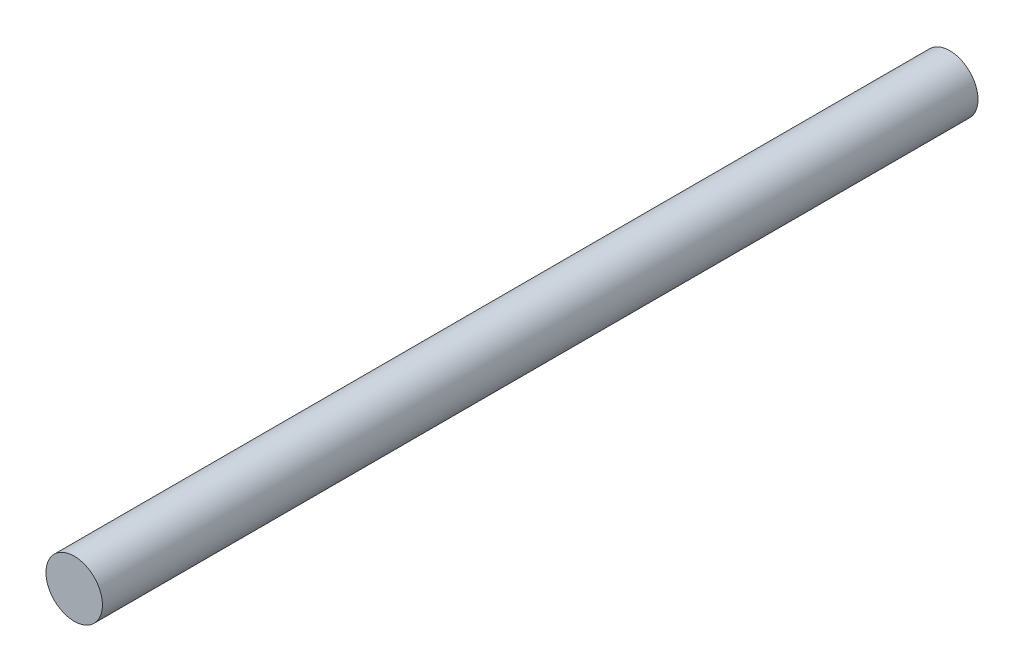
ISO-10303-21;
HEADER;
FILE_DESCRIPTION(('STEP AP214'),'2;1');
FILE_NAME('part.step','',(''),(''),'','','');
FILE_SCHEMA(('AUTOMOTIVE_DESIGN { 1 0 10303 214 1 1 1 1 }'));
ENDSEC;
DATA;
#1=APPLICATION_CONTEXT('core data for automotive mechanical design processes');
#2=APPLICATION_PROTOCOL_DEFINITION('international standard','automotive_design',2000,#1);
#3=PRODUCT_CONTEXT('',#1,'mechanical');
#4=PRODUCT('Part','Part','',(#3));
#5=PRODUCT_RELATED_PRODUCT_CATEGORY('part','',(#4));
#6=PRODUCT_DEFINITION_FORMATION('','',#4);
#7=PRODUCT_DEFINITION_CONTEXT('part definition',#1,'design');
#8=PRODUCT_DEFINITION('design','',#6,#7);
#9=PRODUCT_DEFINITION_SHAPE('','',#8);
#10=(LENGTH_UNIT() NAMED_UNIT(*) SI_UNIT(.MILLI.,.METRE.));
#11=(NAMED_UNIT(*) PLANE_ANGLE_UNIT() SI_UNIT($,.RADIAN.));
#12=(NAMED_UNIT(*) SI_UNIT($,.STERADIAN.) SOLID_ANGLE_UNIT());
#13=UNCERTAINTY_MEASURE_WITH_UNIT(LENGTH_MEASURE(1.E-05),#10,'distance_accuracy_value','');
#14=(GEOMETRIC_REPRESENTATION_CONTEXT(3) GLOBAL_UNCERTAINTY_ASSIGNED_CONTEXT((#13)) GLOBAL_UNIT_ASSIGNED_CONTEXT((#10,
#11,#12)) REPRESENTATION_CONTEXT('',''));
#15=CARTESIAN_POINT('',(0.,0.,0.));
#16=DIRECTION('',(0.,0.,1.));
#17=DIRECTION('',(1.,0.,0.));
#18=AXIS2_PLACEMENT_3D('',#15,#16,#17);
#19=CARTESIAN_POINT('',(0.,0.,124.));
#20=DIRECTION('',(0.,0.,-1.));
#21=DIRECTION('',(-1.,0.,0.));
#22=AXIS2_PLACEMENT_3D('',#19,#20,#21);
#23=CYLINDRICAL_SURFACE('',#22,4.);
#24=CARTESIAN_POINT('',(0.,0.,124.));
#25=DIRECTION('',(0.,0.,1.));
#26=DIRECTION('',(1.,0.,0.));
#27=AXIS2_PLACEMENT_3D('',#24,#25,#26);
#28=CIRCLE('',#27,4.);
#29=CARTESIAN_POINT('',(4.,0.,124.));
#30=VERTEX_POINT('',#29);
#31=EDGE_CURVE('E10',#30,#30,#28,.T.);
#32=ORIENTED_EDGE('',*,*,#31,.F.);
#33=EDGE_LOOP('',(#32));
#34=FACE_BOUND('',#33,.T.);
#35=CARTESIAN_POINT('',(0.,0.,0.));
#36=DIRECTION('',(0.,0.,1.));
#37=DIRECTION('',(1.,0.,0.));
#38=AXIS2_PLACEMENT_3D('',#35,#36,#37);
#39=CIRCLE('',#38,4.);
#40=CARTESIAN_POINT('',(4.,0.,0.));
#41=VERTEX_POINT('',#40);
#42=EDGE_CURVE('E46',#41,#41,#39,.T.);
#43=ORIENTED_EDGE('',*,*,#42,.T.);
#44=EDGE_LOOP('',(#43));
#45=FACE_BOUND('',#44,.T.);
#46=ADVANCED_FACE('F43',(#34,#45),#23,.T.);
#47=CARTESIAN_POINT('',(0.,0.,124.));
#48=DIRECTION('',(0.,0.,1.));
#49=DIRECTION('',(1.,0.,0.));
#50=AXIS2_PLACEMENT_3D('',#47,#48,#49);
#51=PLANE('',#50);
#52=ORIENTED_EDGE('',*,*,#31,.T.);
#53=EDGE_LOOP('',(#52));
#54=FACE_BOUND('',#53,.T.);
#55=ADVANCED_FACE('F60',(#54),#51,.T.);
#56=CARTESIAN_POINT('',(0.,0.,0.));
#57=DIRECTION('',(0.,0.,1.));
#58=DIRECTION('',(1.,0.,0.));
#59=AXIS2_PLACEMENT_3D('',#56,#57,#58);
#60=PLANE('',#59);
#61=ORIENTED_EDGE('',*,*,#42,.F.);
#62=EDGE_LOOP('',(#61));
#63=FACE_BOUND('',#62,.T.);
#64=ADVANCED_FACE('F58',(#63),#60,.F.);
#65=CLOSED_SHELL('',(#46,#55,#64));
#66=MANIFOLD_SOLID_BREP('B2',#65);
#67=ADVANCED_BREP_SHAPE_REPRESENTATION('',(#18,#66),#14);
#68=SHAPE_DEFINITION_REPRESENTATION(#9,#67);
ENDSEC;
END-ISO-10303-21;
